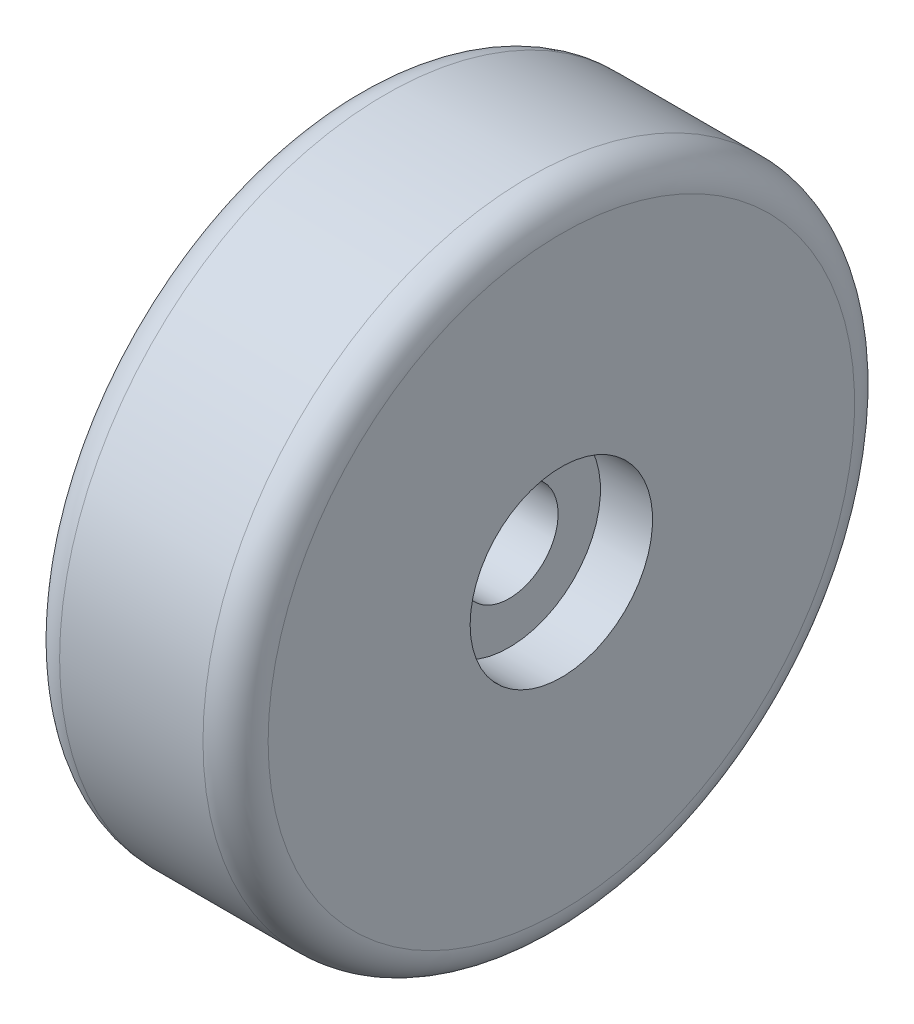
ISO-10303-21;
HEADER;
FILE_DESCRIPTION(('STEP AP214'),'2;1');
FILE_NAME('part.step','',(''),(''),'','','');
FILE_SCHEMA(('AUTOMOTIVE_DESIGN { 1 0 10303 214 1 1 1 1 }'));
ENDSEC;
DATA;
#1=APPLICATION_CONTEXT('core data for automotive mechanical design processes');
#2=APPLICATION_PROTOCOL_DEFINITION('international standard','automotive_design',2000,#1);
#3=PRODUCT_CONTEXT('',#1,'mechanical');
#4=PRODUCT('Part','Part','',(#3));
#5=PRODUCT_RELATED_PRODUCT_CATEGORY('part','',(#4));
#6=PRODUCT_DEFINITION_FORMATION('','',#4);
#7=PRODUCT_DEFINITION_CONTEXT('part definition',#1,'design');
#8=PRODUCT_DEFINITION('design','',#6,#7);
#9=PRODUCT_DEFINITION_SHAPE('','',#8);
#10=(LENGTH_UNIT() NAMED_UNIT(*) SI_UNIT(.MILLI.,.METRE.));
#11=(NAMED_UNIT(*) PLANE_ANGLE_UNIT() SI_UNIT($,.RADIAN.));
#12=(NAMED_UNIT(*) SI_UNIT($,.STERADIAN.) SOLID_ANGLE_UNIT());
#13=UNCERTAINTY_MEASURE_WITH_UNIT(LENGTH_MEASURE(1.E-05),#10,'distance_accuracy_value','');
#14=(GEOMETRIC_REPRESENTATION_CONTEXT(3) GLOBAL_UNCERTAINTY_ASSIGNED_CONTEXT((#13)) GLOBAL_UNIT_ASSIGNED_CONTEXT((#10,
#11,#12)) REPRESENTATION_CONTEXT('',''));
#15=CARTESIAN_POINT('',(0.,0.,0.));
#16=DIRECTION('',(0.,0.,1.));
#17=DIRECTION('',(1.,0.,0.));
#18=AXIS2_PLACEMENT_3D('',#15,#16,#17);
#19=CARTESIAN_POINT('',(16.,14.,0.));
#20=DIRECTION('',(-1.,0.,0.));
#21=DIRECTION('',(0.,0.,1.));
#22=AXIS2_PLACEMENT_3D('',#19,#20,#21);
#23=PLANE('',#22);
#24=CARTESIAN_POINT('',(16.,0.,0.));
#25=DIRECTION('',(-1.,0.,0.));
#26=DIRECTION('',(0.,0.,1.));
#27=AXIS2_PLACEMENT_3D('',#24,#25,#26);
#28=CIRCLE('',#27,45.);
#29=CARTESIAN_POINT('',(16.,0.,45.));
#30=VERTEX_POINT('',#29);
#31=EDGE_CURVE('E10',#30,#30,#28,.F.);
#32=ORIENTED_EDGE('',*,*,#31,.T.);
#33=EDGE_LOOP('',(#32));
#34=FACE_BOUND('',#33,.T.);
#35=CARTESIAN_POINT('',(16.,0.,0.));
#36=DIRECTION('',(-1.,0.,0.));
#37=DIRECTION('',(0.,0.,1.));
#38=AXIS2_PLACEMENT_3D('',#35,#36,#37);
#39=CIRCLE('',#38,14.);
#40=CARTESIAN_POINT('',(16.,0.,14.));
#41=VERTEX_POINT('',#40);
#42=EDGE_CURVE('E54',#41,#41,#39,.T.);
#43=ORIENTED_EDGE('',*,*,#42,.T.);
#44=EDGE_LOOP('',(#43));
#45=FACE_BOUND('',#44,.T.);
#46=ADVANCED_FACE('F34',(#34,#45),#23,.F.);
#47=CARTESIAN_POINT('',(0.,0.,0.));
#48=DIRECTION('',(-1.,0.,0.));
#49=DIRECTION('',(0.,0.,1.));
#50=AXIS2_PLACEMENT_3D('',#47,#48,#49);
#51=CYLINDRICAL_SURFACE('',#50,14.);
#52=ORIENTED_EDGE('',*,*,#42,.F.);
#53=EDGE_LOOP('',(#52));
#54=FACE_BOUND('',#53,.T.);
#55=CARTESIAN_POINT('',(8.,0.,0.));
#56=DIRECTION('',(-1.,0.,0.));
#57=DIRECTION('',(0.,0.,1.));
#58=AXIS2_PLACEMENT_3D('',#55,#56,#57);
#59=CIRCLE('',#58,14.);
#60=CARTESIAN_POINT('',(8.,0.,14.));
#61=VERTEX_POINT('',#60);
#62=EDGE_CURVE('E57',#61,#61,#59,.T.);
#63=ORIENTED_EDGE('',*,*,#62,.T.);
#64=EDGE_LOOP('',(#63));
#65=FACE_BOUND('',#64,.T.);
#66=ADVANCED_FACE('F90',(#54,#65),#51,.F.);
#67=CARTESIAN_POINT('',(8.,7.5,0.));
#68=DIRECTION('',(-1.,0.,0.));
#69=DIRECTION('',(0.,0.,1.));
#70=AXIS2_PLACEMENT_3D('',#67,#68,#69);
#71=PLANE('',#70);
#72=ORIENTED_EDGE('',*,*,#62,.F.);
#73=EDGE_LOOP('',(#72));
#74=FACE_BOUND('',#73,.T.);
#75=CARTESIAN_POINT('',(8.,0.,0.));
#76=DIRECTION('',(-1.,0.,0.));
#77=DIRECTION('',(0.,0.,1.));
#78=AXIS2_PLACEMENT_3D('',#75,#76,#77);
#79=CIRCLE('',#78,7.5);
#80=CARTESIAN_POINT('',(8.,0.,7.5));
#81=VERTEX_POINT('',#80);
#82=EDGE_CURVE('E60',#81,#81,#79,.T.);
#83=ORIENTED_EDGE('',*,*,#82,.T.);
#84=EDGE_LOOP('',(#83));
#85=FACE_BOUND('',#84,.T.);
#86=ADVANCED_FACE('F95',(#74,#85),#71,.F.);
#87=CARTESIAN_POINT('',(0.,0.,0.));
#88=DIRECTION('',(-1.,0.,0.));
#89=DIRECTION('',(0.,0.,1.));
#90=AXIS2_PLACEMENT_3D('',#87,#88,#89);
#91=CYLINDRICAL_SURFACE('',#90,7.5);
#92=ORIENTED_EDGE('',*,*,#82,.F.);
#93=EDGE_LOOP('',(#92));
#94=FACE_BOUND('',#93,.T.);
#95=CARTESIAN_POINT('',(-8.,0.,0.));
#96=DIRECTION('',(-1.,0.,0.));
#97=DIRECTION('',(0.,0.,1.));
#98=AXIS2_PLACEMENT_3D('',#95,#96,#97);
#99=CIRCLE('',#98,7.5);
#100=CARTESIAN_POINT('',(-8.,0.,7.5));
#101=VERTEX_POINT('',#100);
#102=EDGE_CURVE('E63',#101,#101,#99,.T.);
#103=ORIENTED_EDGE('',*,*,#102,.T.);
#104=EDGE_LOOP('',(#103));
#105=FACE_BOUND('',#104,.T.);
#106=ADVANCED_FACE('F141',(#94,#105),#91,.F.);
#107=CARTESIAN_POINT('',(-8.,7.5,0.));
#108=DIRECTION('',(1.,0.,0.));
#109=DIRECTION('',(0.,0.,-1.));
#110=AXIS2_PLACEMENT_3D('',#107,#108,#109);
#111=PLANE('',#110);
#112=ORIENTED_EDGE('',*,*,#102,.F.);
#113=EDGE_LOOP('',(#112));
#114=FACE_BOUND('',#113,.T.);
#115=CARTESIAN_POINT('',(-8.,0.,0.));
#116=DIRECTION('',(-1.,0.,0.));
#117=DIRECTION('',(0.,0.,1.));
#118=AXIS2_PLACEMENT_3D('',#115,#116,#117);
#119=CIRCLE('',#118,14.);
#120=CARTESIAN_POINT('',(-8.,0.,14.));
#121=VERTEX_POINT('',#120);
#122=EDGE_CURVE('E66',#121,#121,#119,.T.);
#123=ORIENTED_EDGE('',*,*,#122,.T.);
#124=EDGE_LOOP('',(#123));
#125=FACE_BOUND('',#124,.T.);
#126=ADVANCED_FACE('F86',(#114,#125),#111,.F.);
#127=CARTESIAN_POINT('',(0.,0.,0.));
#128=DIRECTION('',(-1.,0.,0.));
#129=DIRECTION('',(0.,0.,1.));
#130=AXIS2_PLACEMENT_3D('',#127,#128,#129);
#131=CYLINDRICAL_SURFACE('',#130,14.);
#132=ORIENTED_EDGE('',*,*,#122,.F.);
#133=EDGE_LOOP('',(#132));
#134=FACE_BOUND('',#133,.T.);
#135=CARTESIAN_POINT('',(-16.,0.,0.));
#136=DIRECTION('',(-1.,0.,0.));
#137=DIRECTION('',(0.,0.,1.));
#138=AXIS2_PLACEMENT_3D('',#135,#136,#137);
#139=CIRCLE('',#138,14.);
#140=CARTESIAN_POINT('',(-16.,0.,14.));
#141=VERTEX_POINT('',#140);
#142=EDGE_CURVE('E69',#141,#141,#139,.T.);
#143=ORIENTED_EDGE('',*,*,#142,.T.);
#144=EDGE_LOOP('',(#143));
#145=FACE_BOUND('',#144,.T.);
#146=ADVANCED_FACE('F73',(#134,#145),#131,.F.);
#147=CARTESIAN_POINT('',(-16.,14.,0.));
#148=DIRECTION('',(1.,0.,0.));
#149=DIRECTION('',(0.,0.,-1.));
#150=AXIS2_PLACEMENT_3D('',#147,#148,#149);
#151=PLANE('',#150);
#152=CARTESIAN_POINT('',(-16.,0.,0.));
#153=DIRECTION('',(1.,0.,0.));
#154=DIRECTION('',(0.,0.,-1.));
#155=AXIS2_PLACEMENT_3D('',#152,#153,#154);
#156=CIRCLE('',#155,45.);
#157=CARTESIAN_POINT('',(-16.,0.,-45.));
#158=VERTEX_POINT('',#157);
#159=EDGE_CURVE('E49',#158,#158,#156,.F.);
#160=ORIENTED_EDGE('',*,*,#159,.T.);
#161=EDGE_LOOP('',(#160));
#162=FACE_BOUND('',#161,.T.);
#163=ORIENTED_EDGE('',*,*,#142,.F.);
#164=EDGE_LOOP('',(#163));
#165=FACE_BOUND('',#164,.T.);
#166=ADVANCED_FACE('F75',(#162,#165),#151,.F.);
#167=CARTESIAN_POINT('',(0.,0.,0.));
#168=DIRECTION('',(-1.,0.,0.));
#169=DIRECTION('',(0.,0.,1.));
#170=AXIS2_PLACEMENT_3D('',#167,#168,#169);
#171=CYLINDRICAL_SURFACE('',#170,50.);
#172=CARTESIAN_POINT('',(-11.,0.,0.));
#173=DIRECTION('',(1.,0.,0.));
#174=DIRECTION('',(0.,0.,-1.));
#175=AXIS2_PLACEMENT_3D('',#172,#173,#174);
#176=CIRCLE('',#175,50.);
#177=CARTESIAN_POINT('',(-11.,0.,-50.));
#178=VERTEX_POINT('',#177);
#179=EDGE_CURVE('E41',#178,#178,#176,.T.);
#180=ORIENTED_EDGE('',*,*,#179,.T.);
#181=EDGE_LOOP('',(#180));
#182=FACE_BOUND('',#181,.T.);
#183=CARTESIAN_POINT('',(11.,0.,0.));
#184=DIRECTION('',(-1.,0.,0.));
#185=DIRECTION('',(0.,0.,1.));
#186=AXIS2_PLACEMENT_3D('',#183,#184,#185);
#187=CIRCLE('',#186,50.);
#188=CARTESIAN_POINT('',(11.,0.,50.));
#189=VERTEX_POINT('',#188);
#190=EDGE_CURVE('E45',#189,#189,#187,.T.);
#191=ORIENTED_EDGE('',*,*,#190,.T.);
#192=EDGE_LOOP('',(#191));
#193=FACE_BOUND('',#192,.T.);
#194=ADVANCED_FACE('F77',(#182,#193),#171,.T.);
#195=CARTESIAN_POINT('',(-11.,0.,0.));
#196=DIRECTION('',(1.,0.,0.));
#197=DIRECTION('',(0.,0.,-1.));
#198=AXIS2_PLACEMENT_3D('',#195,#196,#197);
#199=TOROIDAL_SURFACE('',#198,45.,5.);
#200=ORIENTED_EDGE('',*,*,#179,.F.);
#201=EDGE_LOOP('',(#200));
#202=FACE_BOUND('',#201,.T.);
#203=ORIENTED_EDGE('',*,*,#159,.F.);
#204=EDGE_LOOP('',(#203));
#205=FACE_BOUND('',#204,.T.);
#206=ADVANCED_FACE('F84',(#202,#205),#199,.T.);
#207=CARTESIAN_POINT('',(11.,0.,0.));
#208=DIRECTION('',(-1.,0.,0.));
#209=DIRECTION('',(0.,0.,1.));
#210=AXIS2_PLACEMENT_3D('',#207,#208,#209);
#211=TOROIDAL_SURFACE('',#210,45.,5.);
#212=ORIENTED_EDGE('',*,*,#31,.F.);
#213=EDGE_LOOP('',(#212));
#214=FACE_BOUND('',#213,.T.);
#215=ORIENTED_EDGE('',*,*,#190,.F.);
#216=EDGE_LOOP('',(#215));
#217=FACE_BOUND('',#216,.T.);
#218=ADVANCED_FACE('F36',(#214,#217),#211,.T.);
#219=CLOSED_SHELL('',(#46,#66,#86,#106,#126,#146,#166,#194,#206,#218));
#220=MANIFOLD_SOLID_BREP('B2',#219);
#221=ADVANCED_BREP_SHAPE_REPRESENTATION('',(#18,#220),#14);
#222=SHAPE_DEFINITION_REPRESENTATION(#9,#221);
ENDSEC;
END-ISO-10303-21;
